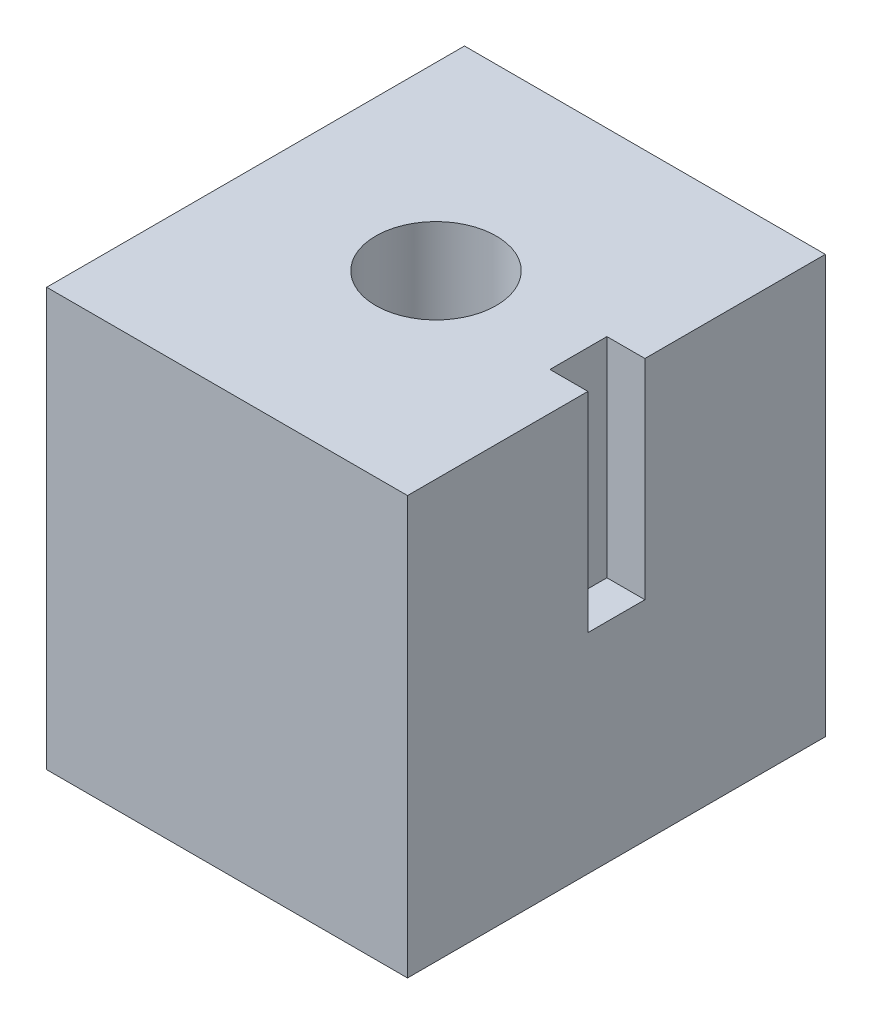
ISO-10303-21;
HEADER;
FILE_DESCRIPTION(('STEP AP214'),'2;1');
FILE_NAME('part.step','',(''),(''),'','','');
FILE_SCHEMA(('AUTOMOTIVE_DESIGN { 1 0 10303 214 1 1 1 1 }'));
ENDSEC;
DATA;
#1=APPLICATION_CONTEXT('core data for automotive mechanical design processes');
#2=APPLICATION_PROTOCOL_DEFINITION('international standard','automotive_design',2000,#1);
#3=PRODUCT_CONTEXT('',#1,'mechanical');
#4=PRODUCT('Part','Part','',(#3));
#5=PRODUCT_RELATED_PRODUCT_CATEGORY('part','',(#4));
#6=PRODUCT_DEFINITION_FORMATION('','',#4);
#7=PRODUCT_DEFINITION_CONTEXT('part definition',#1,'design');
#8=PRODUCT_DEFINITION('design','',#6,#7);
#9=PRODUCT_DEFINITION_SHAPE('','',#8);
#10=(LENGTH_UNIT() NAMED_UNIT(*) SI_UNIT(.MILLI.,.METRE.));
#11=(NAMED_UNIT(*) PLANE_ANGLE_UNIT() SI_UNIT($,.RADIAN.));
#12=(NAMED_UNIT(*) SI_UNIT($,.STERADIAN.) SOLID_ANGLE_UNIT());
#13=UNCERTAINTY_MEASURE_WITH_UNIT(LENGTH_MEASURE(1.E-05),#10,'distance_accuracy_value','');
#14=(GEOMETRIC_REPRESENTATION_CONTEXT(3) GLOBAL_UNCERTAINTY_ASSIGNED_CONTEXT((#13)) GLOBAL_UNIT_ASSIGNED_CONTEXT((#10,
#11,#12)) REPRESENTATION_CONTEXT('',''));
#15=CARTESIAN_POINT('',(0.,0.,0.));
#16=DIRECTION('',(0.,0.,1.));
#17=DIRECTION('',(1.,0.,0.));
#18=AXIS2_PLACEMENT_3D('',#15,#16,#17);
#19=CARTESIAN_POINT('',(0.,-30.9802561210692,0.));
#20=DIRECTION('',(0.,1.,0.));
#21=DIRECTION('',(0.,0.,1.));
#22=AXIS2_PLACEMENT_3D('',#19,#20,#21);
#23=CYLINDRICAL_SURFACE('',#22,3.175);
#24=CARTESIAN_POINT('',(0.,0.,0.));
#25=DIRECTION('',(0.,1.,0.));
#26=DIRECTION('',(0.,0.,1.));
#27=AXIS2_PLACEMENT_3D('',#24,#25,#26);
#28=CIRCLE('',#27,3.175);
#29=CARTESIAN_POINT('',(0.,0.,3.175));
#30=VERTEX_POINT('',#29);
#31=EDGE_CURVE('E150',#30,#30,#28,.T.);
#32=ORIENTED_EDGE('',*,*,#31,.T.);
#33=EDGE_LOOP('',(#32));
#34=FACE_BOUND('',#33,.T.);
#35=CARTESIAN_POINT('',(0.,-16.5,0.));
#36=DIRECTION('',(0.,-1.,0.));
#37=DIRECTION('',(0.,0.,-1.));
#38=AXIS2_PLACEMENT_3D('',#35,#36,#37);
#39=CIRCLE('',#38,3.175);
#40=CARTESIAN_POINT('',(0.,-16.5,-3.175));
#41=VERTEX_POINT('',#40);
#42=EDGE_CURVE('E39',#41,#41,#39,.F.);
#43=ORIENTED_EDGE('',*,*,#42,.F.);
#44=EDGE_LOOP('',(#43));
#45=FACE_BOUND('',#44,.T.);
#46=ADVANCED_FACE('F35',(#34,#45),#23,.F.);
#47=CARTESIAN_POINT('',(9.49999999999997,-22.,11.));
#48=DIRECTION('',(1.,0.,0.));
#49=DIRECTION('',(0.,0.,-1.));
#50=AXIS2_PLACEMENT_3D('',#47,#48,#49);
#51=PLANE('',#50);
#52=DIRECTION('',(0.,1.,0.));
#53=VECTOR('',#52,1.);
#54=CARTESIAN_POINT('',(9.49999999999997,-11.,-1.5));
#55=LINE('',#54,#53);
#56=CARTESIAN_POINT('',(9.49999999999997,-11.,-1.5));
#57=VERTEX_POINT('',#56);
#58=CARTESIAN_POINT('',(9.49999999999997,0.,-1.5));
#59=VERTEX_POINT('',#58);
#60=EDGE_CURVE('E142',#57,#59,#55,.T.);
#61=ORIENTED_EDGE('',*,*,#60,.F.);
#62=DIRECTION('',(0.,0.,-1.));
#63=VECTOR('',#62,1.);
#64=CARTESIAN_POINT('',(9.49999999999997,-11.,-1.5));
#65=LINE('',#64,#63);
#66=CARTESIAN_POINT('',(9.49999999999997,-11.,1.5));
#67=VERTEX_POINT('',#66);
#68=EDGE_CURVE('E125',#67,#57,#65,.T.);
#69=ORIENTED_EDGE('',*,*,#68,.F.);
#70=DIRECTION('',(0.,1.,0.));
#71=VECTOR('',#70,1.);
#72=CARTESIAN_POINT('',(9.49999999999997,-11.,1.5));
#73=LINE('',#72,#71);
#74=CARTESIAN_POINT('',(9.49999999999997,0.,1.5));
#75=VERTEX_POINT('',#74);
#76=EDGE_CURVE('E116',#67,#75,#73,.T.);
#77=ORIENTED_EDGE('',*,*,#76,.T.);
#78=DIRECTION('',(0.,0.,-1.));
#79=VECTOR('',#78,1.);
#80=CARTESIAN_POINT('',(9.49999999999997,0.,11.));
#81=LINE('',#80,#79);
#82=CARTESIAN_POINT('',(9.49999999999997,0.,11.));
#83=VERTEX_POINT('',#82);
#84=EDGE_CURVE('E164',#83,#75,#81,.T.);
#85=ORIENTED_EDGE('',*,*,#84,.F.);
#86=DIRECTION('',(0.,1.,0.));
#87=VECTOR('',#86,1.);
#88=CARTESIAN_POINT('',(9.49999999999997,-22.,11.));
#89=LINE('',#88,#87);
#90=CARTESIAN_POINT('',(9.49999999999997,-22.,11.));
#91=VERTEX_POINT('',#90);
#92=EDGE_CURVE('E11',#91,#83,#89,.T.);
#93=ORIENTED_EDGE('',*,*,#92,.F.);
#94=DIRECTION('',(0.,0.,-1.));
#95=VECTOR('',#94,1.);
#96=CARTESIAN_POINT('',(9.49999999999997,-22.,11.));
#97=LINE('',#96,#95);
#98=CARTESIAN_POINT('',(9.49999999999997,-22.,-11.));
#99=VERTEX_POINT('',#98);
#100=EDGE_CURVE('E154',#91,#99,#97,.T.);
#101=ORIENTED_EDGE('',*,*,#100,.T.);
#102=DIRECTION('',(0.,1.,0.));
#103=VECTOR('',#102,1.);
#104=CARTESIAN_POINT('',(9.49999999999997,-22.,-11.));
#105=LINE('',#104,#103);
#106=CARTESIAN_POINT('',(9.49999999999997,0.,-11.));
#107=VERTEX_POINT('',#106);
#108=EDGE_CURVE('E86',#99,#107,#105,.T.);
#109=ORIENTED_EDGE('',*,*,#108,.T.);
#110=EDGE_CURVE('E153',#59,#107,#81,.T.);
#111=ORIENTED_EDGE('',*,*,#110,.F.);
#112=EDGE_LOOP('',(#61,#69,#77,#85,#93,#101,#109,#111));
#113=FACE_BOUND('',#112,.T.);
#114=ADVANCED_FACE('F37',(#113),#51,.T.);
#115=CARTESIAN_POINT('',(-9.50000000000003,-22.,11.));
#116=DIRECTION('',(0.,0.,1.));
#117=DIRECTION('',(1.,0.,0.));
#118=AXIS2_PLACEMENT_3D('',#115,#116,#117);
#119=PLANE('',#118);
#120=DIRECTION('',(1.,0.,0.));
#121=VECTOR('',#120,1.);
#122=CARTESIAN_POINT('',(-9.50000000000003,0.,11.));
#123=LINE('',#122,#121);
#124=CARTESIAN_POINT('',(-9.50000000000003,0.,11.));
#125=VERTEX_POINT('',#124);
#126=EDGE_CURVE('E157',#125,#83,#123,.T.);
#127=ORIENTED_EDGE('',*,*,#126,.F.);
#128=DIRECTION('',(0.,1.,0.));
#129=VECTOR('',#128,1.);
#130=CARTESIAN_POINT('',(-9.50000000000003,-22.,11.));
#131=LINE('',#130,#129);
#132=CARTESIAN_POINT('',(-9.50000000000003,-22.,11.));
#133=VERTEX_POINT('',#132);
#134=EDGE_CURVE('E44',#133,#125,#131,.T.);
#135=ORIENTED_EDGE('',*,*,#134,.F.);
#136=DIRECTION('',(1.,0.,0.));
#137=VECTOR('',#136,1.);
#138=CARTESIAN_POINT('',(-9.50000000000003,-22.,11.));
#139=LINE('',#138,#137);
#140=EDGE_CURVE('E162',#133,#91,#139,.T.);
#141=ORIENTED_EDGE('',*,*,#140,.T.);
#142=ORIENTED_EDGE('',*,*,#92,.T.);
#143=EDGE_LOOP('',(#127,#135,#141,#142));
#144=FACE_BOUND('',#143,.T.);
#145=ADVANCED_FACE('F186',(#144),#119,.T.);
#146=CARTESIAN_POINT('',(-9.50000000000003,-22.,11.));
#147=DIRECTION('',(-1.,0.,0.));
#148=DIRECTION('',(0.,0.,1.));
#149=AXIS2_PLACEMENT_3D('',#146,#147,#148);
#150=PLANE('',#149);
#151=DIRECTION('',(0.,0.,1.));
#152=VECTOR('',#151,1.);
#153=CARTESIAN_POINT('',(-9.50000000000003,0.,11.));
#154=LINE('',#153,#152);
#155=CARTESIAN_POINT('',(-9.50000000000003,0.,-11.));
#156=VERTEX_POINT('',#155);
#157=EDGE_CURVE('E170',#156,#125,#154,.T.);
#158=ORIENTED_EDGE('',*,*,#157,.F.);
#159=DIRECTION('',(0.,1.,0.));
#160=VECTOR('',#159,1.);
#161=CARTESIAN_POINT('',(-9.50000000000003,-22.,-11.));
#162=LINE('',#161,#160);
#163=CARTESIAN_POINT('',(-9.50000000000003,-22.,-11.));
#164=VERTEX_POINT('',#163);
#165=EDGE_CURVE('E176',#164,#156,#162,.T.);
#166=ORIENTED_EDGE('',*,*,#165,.F.);
#167=DIRECTION('',(0.,0.,1.));
#168=VECTOR('',#167,1.);
#169=CARTESIAN_POINT('',(-9.50000000000003,-22.,11.));
#170=LINE('',#169,#168);
#171=EDGE_CURVE('E159',#164,#133,#170,.T.);
#172=ORIENTED_EDGE('',*,*,#171,.T.);
#173=ORIENTED_EDGE('',*,*,#134,.T.);
#174=EDGE_LOOP('',(#158,#166,#172,#173));
#175=FACE_BOUND('',#174,.T.);
#176=ADVANCED_FACE('F190',(#175),#150,.T.);
#177=CARTESIAN_POINT('',(-9.50000000000003,-22.,-11.));
#178=DIRECTION('',(0.,0.,-1.));
#179=DIRECTION('',(-1.,0.,0.));
#180=AXIS2_PLACEMENT_3D('',#177,#178,#179);
#181=PLANE('',#180);
#182=DIRECTION('',(-1.,0.,0.));
#183=VECTOR('',#182,1.);
#184=CARTESIAN_POINT('',(-9.50000000000003,0.,-11.));
#185=LINE('',#184,#183);
#186=EDGE_CURVE('E167',#107,#156,#185,.T.);
#187=ORIENTED_EDGE('',*,*,#186,.F.);
#188=ORIENTED_EDGE('',*,*,#108,.F.);
#189=DIRECTION('',(-1.,0.,0.));
#190=VECTOR('',#189,1.);
#191=CARTESIAN_POINT('',(-9.50000000000003,-22.,-11.));
#192=LINE('',#191,#190);
#193=EDGE_CURVE('E156',#99,#164,#192,.T.);
#194=ORIENTED_EDGE('',*,*,#193,.T.);
#195=ORIENTED_EDGE('',*,*,#165,.T.);
#196=EDGE_LOOP('',(#187,#188,#194,#195));
#197=FACE_BOUND('',#196,.T.);
#198=ADVANCED_FACE('F179',(#197),#181,.T.);
#199=CARTESIAN_POINT('',(0.,-22.,0.));
#200=DIRECTION('',(0.,-1.,0.));
#201=DIRECTION('',(0.,0.,-1.));
#202=AXIS2_PLACEMENT_3D('',#199,#200,#201);
#203=PLANE('',#202);
#204=CARTESIAN_POINT('',(0.,-22.,0.));
#205=DIRECTION('',(0.,-1.,0.));
#206=DIRECTION('',(0.,0.,-1.));
#207=AXIS2_PLACEMENT_3D('',#204,#205,#206);
#208=CIRCLE('',#207,7.5);
#209=CARTESIAN_POINT('',(0.,-22.,-7.5));
#210=VERTEX_POINT('',#209);
#211=EDGE_CURVE('E141',#210,#210,#208,.T.);
#212=ORIENTED_EDGE('',*,*,#211,.F.);
#213=EDGE_LOOP('',(#212));
#214=FACE_BOUND('',#213,.T.);
#215=ORIENTED_EDGE('',*,*,#100,.F.);
#216=ORIENTED_EDGE('',*,*,#140,.F.);
#217=ORIENTED_EDGE('',*,*,#171,.F.);
#218=ORIENTED_EDGE('',*,*,#193,.F.);
#219=EDGE_LOOP('',(#215,#216,#217,#218));
#220=FACE_BOUND('',#219,.T.);
#221=ADVANCED_FACE('F192',(#214,#220),#203,.T.);
#222=CARTESIAN_POINT('',(0.,0.,0.));
#223=DIRECTION('',(0.,-1.,0.));
#224=DIRECTION('',(0.,0.,-1.));
#225=AXIS2_PLACEMENT_3D('',#222,#223,#224);
#226=PLANE('',#225);
#227=ORIENTED_EDGE('',*,*,#31,.F.);
#228=EDGE_LOOP('',(#227));
#229=FACE_BOUND('',#228,.T.);
#230=DIRECTION('',(0.,0.,1.));
#231=VECTOR('',#230,1.);
#232=CARTESIAN_POINT('',(7.49999999999997,0.,-1.5));
#233=LINE('',#232,#231);
#234=CARTESIAN_POINT('',(7.49999999999997,0.,-1.5));
#235=VERTEX_POINT('',#234);
#236=CARTESIAN_POINT('',(7.49999999999997,0.,1.5));
#237=VERTEX_POINT('',#236);
#238=EDGE_CURVE('E52',#235,#237,#233,.T.);
#239=ORIENTED_EDGE('',*,*,#238,.F.);
#240=DIRECTION('',(-1.,0.,0.));
#241=VECTOR('',#240,1.);
#242=CARTESIAN_POINT('',(9.49999999999997,0.,-1.5));
#243=LINE('',#242,#241);
#244=EDGE_CURVE('E129',#59,#235,#243,.T.);
#245=ORIENTED_EDGE('',*,*,#244,.F.);
#246=ORIENTED_EDGE('',*,*,#110,.T.);
#247=ORIENTED_EDGE('',*,*,#186,.T.);
#248=ORIENTED_EDGE('',*,*,#157,.T.);
#249=ORIENTED_EDGE('',*,*,#126,.T.);
#250=ORIENTED_EDGE('',*,*,#84,.T.);
#251=DIRECTION('',(1.,0.,0.));
#252=VECTOR('',#251,1.);
#253=CARTESIAN_POINT('',(9.49999999999997,0.,1.5));
#254=LINE('',#253,#252);
#255=EDGE_CURVE('E132',#237,#75,#254,.T.);
#256=ORIENTED_EDGE('',*,*,#255,.F.);
#257=EDGE_LOOP('',(#239,#245,#246,#247,#248,#249,#250,#256));
#258=FACE_BOUND('',#257,.T.);
#259=ADVANCED_FACE('F182',(#229,#258),#226,.F.);
#260=CARTESIAN_POINT('',(0.,-16.5,0.));
#261=DIRECTION('',(0.,-1.,0.));
#262=DIRECTION('',(0.,0.,-1.));
#263=AXIS2_PLACEMENT_3D('',#260,#261,#262);
#264=PLANE('',#263);
#265=CARTESIAN_POINT('',(0.,-16.5,0.));
#266=DIRECTION('',(0.,-1.,0.));
#267=DIRECTION('',(0.,0.,-1.));
#268=AXIS2_PLACEMENT_3D('',#265,#266,#267);
#269=CIRCLE('',#268,7.5);
#270=CARTESIAN_POINT('',(0.,-16.5,-7.5));
#271=VERTEX_POINT('',#270);
#272=EDGE_CURVE('E145',#271,#271,#269,.T.);
#273=ORIENTED_EDGE('',*,*,#272,.T.);
#274=EDGE_LOOP('',(#273));
#275=FACE_BOUND('',#274,.T.);
#276=ORIENTED_EDGE('',*,*,#42,.T.);
#277=EDGE_LOOP('',(#276));
#278=FACE_BOUND('',#277,.T.);
#279=ADVANCED_FACE('F201',(#275,#278),#264,.T.);
#280=CARTESIAN_POINT('',(0.,-16.5,0.));
#281=DIRECTION('',(0.,-1.,0.));
#282=DIRECTION('',(0.,0.,-1.));
#283=AXIS2_PLACEMENT_3D('',#280,#281,#282);
#284=CYLINDRICAL_SURFACE('',#283,7.5);
#285=ORIENTED_EDGE('',*,*,#272,.F.);
#286=EDGE_LOOP('',(#285));
#287=FACE_BOUND('',#286,.T.);
#288=ORIENTED_EDGE('',*,*,#211,.T.);
#289=EDGE_LOOP('',(#288));
#290=FACE_BOUND('',#289,.T.);
#291=ADVANCED_FACE('F214',(#287,#290),#284,.F.);
#292=CARTESIAN_POINT('',(7.49999999999997,-11.,-1.5));
#293=DIRECTION('',(-1.,0.,0.));
#294=DIRECTION('',(0.,0.,1.));
#295=AXIS2_PLACEMENT_3D('',#292,#293,#294);
#296=PLANE('',#295);
#297=ORIENTED_EDGE('',*,*,#238,.T.);
#298=DIRECTION('',(0.,1.,0.));
#299=VECTOR('',#298,1.);
#300=CARTESIAN_POINT('',(7.49999999999997,-11.,1.5));
#301=LINE('',#300,#299);
#302=CARTESIAN_POINT('',(7.49999999999997,-11.,1.5));
#303=VERTEX_POINT('',#302);
#304=EDGE_CURVE('E108',#303,#237,#301,.T.);
#305=ORIENTED_EDGE('',*,*,#304,.F.);
#306=DIRECTION('',(0.,0.,1.));
#307=VECTOR('',#306,1.);
#308=CARTESIAN_POINT('',(7.49999999999997,-11.,-1.5));
#309=LINE('',#308,#307);
#310=CARTESIAN_POINT('',(7.49999999999997,-11.,-1.5));
#311=VERTEX_POINT('',#310);
#312=EDGE_CURVE('E112',#311,#303,#309,.T.);
#313=ORIENTED_EDGE('',*,*,#312,.F.);
#314=DIRECTION('',(0.,1.,0.));
#315=VECTOR('',#314,1.);
#316=CARTESIAN_POINT('',(7.49999999999997,-11.,-1.5));
#317=LINE('',#316,#315);
#318=EDGE_CURVE('E139',#311,#235,#317,.T.);
#319=ORIENTED_EDGE('',*,*,#318,.T.);
#320=EDGE_LOOP('',(#297,#305,#313,#319));
#321=FACE_BOUND('',#320,.T.);
#322=ADVANCED_FACE('F110',(#321),#296,.F.);
#323=CARTESIAN_POINT('',(9.49999999999997,-11.,-1.5));
#324=DIRECTION('',(0.,0.,-1.));
#325=DIRECTION('',(-1.,0.,0.));
#326=AXIS2_PLACEMENT_3D('',#323,#324,#325);
#327=PLANE('',#326);
#328=ORIENTED_EDGE('',*,*,#244,.T.);
#329=ORIENTED_EDGE('',*,*,#318,.F.);
#330=DIRECTION('',(-1.,0.,0.));
#331=VECTOR('',#330,1.);
#332=CARTESIAN_POINT('',(9.49999999999997,-11.,-1.5));
#333=LINE('',#332,#331);
#334=EDGE_CURVE('E117',#57,#311,#333,.T.);
#335=ORIENTED_EDGE('',*,*,#334,.F.);
#336=ORIENTED_EDGE('',*,*,#60,.T.);
#337=EDGE_LOOP('',(#328,#329,#335,#336));
#338=FACE_BOUND('',#337,.T.);
#339=ADVANCED_FACE('F185',(#338),#327,.F.);
#340=CARTESIAN_POINT('',(9.49999999999997,-11.,1.5));
#341=DIRECTION('',(0.,0.,1.));
#342=DIRECTION('',(1.,0.,0.));
#343=AXIS2_PLACEMENT_3D('',#340,#341,#342);
#344=PLANE('',#343);
#345=ORIENTED_EDGE('',*,*,#255,.T.);
#346=ORIENTED_EDGE('',*,*,#76,.F.);
#347=DIRECTION('',(1.,0.,0.));
#348=VECTOR('',#347,1.);
#349=CARTESIAN_POINT('',(9.49999999999997,-11.,1.5));
#350=LINE('',#349,#348);
#351=EDGE_CURVE('E120',#303,#67,#350,.T.);
#352=ORIENTED_EDGE('',*,*,#351,.F.);
#353=ORIENTED_EDGE('',*,*,#304,.T.);
#354=EDGE_LOOP('',(#345,#346,#352,#353));
#355=FACE_BOUND('',#354,.T.);
#356=ADVANCED_FACE('F121',(#355),#344,.F.);
#357=CARTESIAN_POINT('',(0.,-11.,0.));
#358=DIRECTION('',(0.,-1.,0.));
#359=DIRECTION('',(0.,0.,-1.));
#360=AXIS2_PLACEMENT_3D('',#357,#358,#359);
#361=PLANE('',#360);
#362=ORIENTED_EDGE('',*,*,#312,.T.);
#363=ORIENTED_EDGE('',*,*,#351,.T.);
#364=ORIENTED_EDGE('',*,*,#68,.T.);
#365=ORIENTED_EDGE('',*,*,#334,.T.);
#366=EDGE_LOOP('',(#362,#363,#364,#365));
#367=FACE_BOUND('',#366,.T.);
#368=ADVANCED_FACE('F127',(#367),#361,.F.);
#369=CLOSED_SHELL('',(#46,#114,#145,#176,#198,#221,#259,#279,#291,#322,#339,#356,#368));
#370=MANIFOLD_SOLID_BREP('B2',#369);
#371=ADVANCED_BREP_SHAPE_REPRESENTATION('',(#18,#370),#14);
#372=SHAPE_DEFINITION_REPRESENTATION(#9,#371);
ENDSEC;
END-ISO-10303-21;
